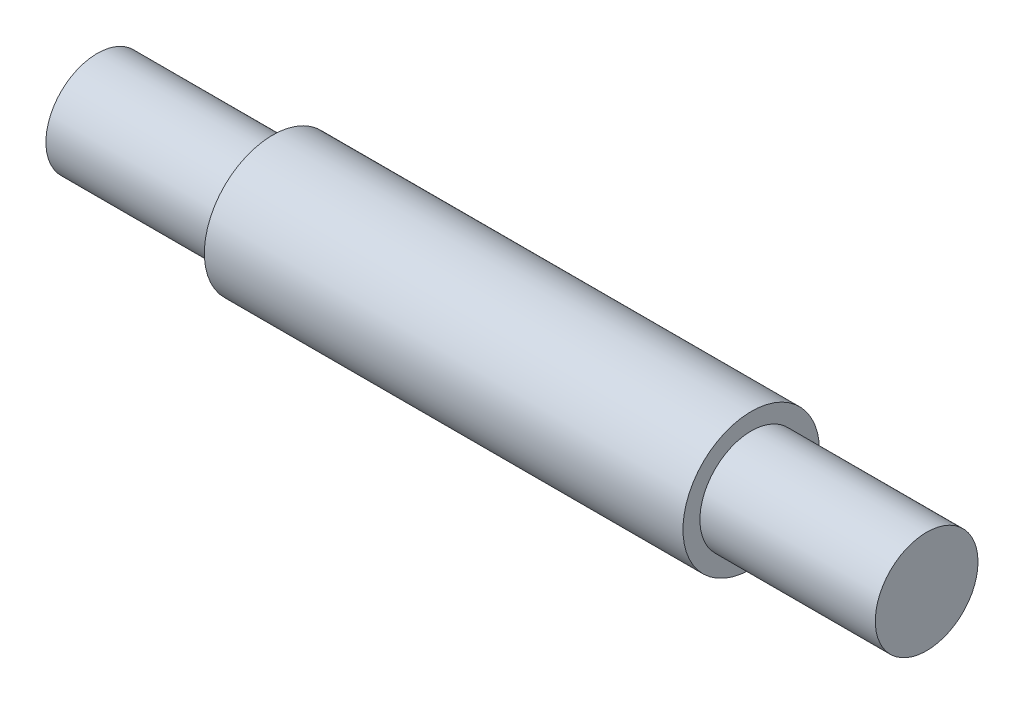
ISO-10303-21;
HEADER;
FILE_DESCRIPTION(('STEP AP214'),'2;1');
FILE_NAME('part.step','',(''),(''),'','','');
FILE_SCHEMA(('AUTOMOTIVE_DESIGN { 1 0 10303 214 1 1 1 1 }'));
ENDSEC;
DATA;
#1=APPLICATION_CONTEXT('core data for automotive mechanical design processes');
#2=APPLICATION_PROTOCOL_DEFINITION('international standard','automotive_design',2000,#1);
#3=PRODUCT_CONTEXT('',#1,'mechanical');
#4=PRODUCT('Part','Part','',(#3));
#5=PRODUCT_RELATED_PRODUCT_CATEGORY('part','',(#4));
#6=PRODUCT_DEFINITION_FORMATION('','',#4);
#7=PRODUCT_DEFINITION_CONTEXT('part definition',#1,'design');
#8=PRODUCT_DEFINITION('design','',#6,#7);
#9=PRODUCT_DEFINITION_SHAPE('','',#8);
#10=(LENGTH_UNIT() NAMED_UNIT(*) SI_UNIT(.MILLI.,.METRE.));
#11=(NAMED_UNIT(*) PLANE_ANGLE_UNIT() SI_UNIT($,.RADIAN.));
#12=(NAMED_UNIT(*) SI_UNIT($,.STERADIAN.) SOLID_ANGLE_UNIT());
#13=UNCERTAINTY_MEASURE_WITH_UNIT(LENGTH_MEASURE(1.E-05),#10,'distance_accuracy_value','');
#14=(GEOMETRIC_REPRESENTATION_CONTEXT(3) GLOBAL_UNCERTAINTY_ASSIGNED_CONTEXT((#13)) GLOBAL_UNIT_ASSIGNED_CONTEXT((#10,
#11,#12)) REPRESENTATION_CONTEXT('',''));
#15=CARTESIAN_POINT('',(0.,0.,0.));
#16=DIRECTION('',(0.,0.,1.));
#17=DIRECTION('',(1.,0.,0.));
#18=AXIS2_PLACEMENT_3D('',#15,#16,#17);
#19=CARTESIAN_POINT('',(19.2786,0.,0.));
#20=DIRECTION('',(-1.,0.,0.));
#21=DIRECTION('',(0.,0.,1.));
#22=AXIS2_PLACEMENT_3D('',#19,#20,#21);
#23=CYLINDRICAL_SURFACE('',#22,3.175);
#24=CARTESIAN_POINT('',(11.1252,0.,0.));
#25=DIRECTION('',(1.,0.,0.));
#26=DIRECTION('',(0.,0.,-1.));
#27=AXIS2_PLACEMENT_3D('',#24,#25,#26);
#28=CIRCLE('',#27,3.175);
#29=CARTESIAN_POINT('',(11.1252,0.,-3.175));
#30=VERTEX_POINT('',#29);
#31=EDGE_CURVE('E10',#30,#30,#28,.T.);
#32=ORIENTED_EDGE('',*,*,#31,.F.);
#33=EDGE_LOOP('',(#32));
#34=FACE_BOUND('',#33,.T.);
#35=CARTESIAN_POINT('',(-11.1252,0.,0.));
#36=DIRECTION('',(1.,0.,0.));
#37=DIRECTION('',(0.,0.,-1.));
#38=AXIS2_PLACEMENT_3D('',#35,#36,#37);
#39=CIRCLE('',#38,3.175);
#40=CARTESIAN_POINT('',(-11.1252,0.,-3.175));
#41=VERTEX_POINT('',#40);
#42=EDGE_CURVE('E55',#41,#41,#39,.T.);
#43=ORIENTED_EDGE('',*,*,#42,.T.);
#44=EDGE_LOOP('',(#43));
#45=FACE_BOUND('',#44,.T.);
#46=ADVANCED_FACE('F37',(#34,#45),#23,.T.);
#47=CARTESIAN_POINT('',(11.1252,0.,0.));
#48=DIRECTION('',(1.,0.,0.));
#49=DIRECTION('',(0.,0.,-1.));
#50=AXIS2_PLACEMENT_3D('',#47,#48,#49);
#51=PLANE('',#50);
#52=CARTESIAN_POINT('',(11.1252,0.,0.));
#53=DIRECTION('',(1.,0.,0.));
#54=DIRECTION('',(0.,0.,-1.));
#55=AXIS2_PLACEMENT_3D('',#52,#53,#54);
#56=CIRCLE('',#55,2.3876);
#57=CARTESIAN_POINT('',(11.1252,0.,-2.3876));
#58=VERTEX_POINT('',#57);
#59=EDGE_CURVE('E44',#58,#58,#56,.T.);
#60=ORIENTED_EDGE('',*,*,#59,.F.);
#61=EDGE_LOOP('',(#60));
#62=FACE_BOUND('',#61,.T.);
#63=ORIENTED_EDGE('',*,*,#31,.T.);
#64=EDGE_LOOP('',(#63));
#65=FACE_BOUND('',#64,.T.);
#66=ADVANCED_FACE('F83',(#62,#65),#51,.T.);
#67=CARTESIAN_POINT('',(11.1252,0.,0.));
#68=DIRECTION('',(1.,0.,0.));
#69=DIRECTION('',(0.,0.,-1.));
#70=AXIS2_PLACEMENT_3D('',#67,#68,#69);
#71=CYLINDRICAL_SURFACE('',#70,2.3876);
#72=ORIENTED_EDGE('',*,*,#59,.T.);
#73=EDGE_LOOP('',(#72));
#74=FACE_BOUND('',#73,.T.);
#75=CARTESIAN_POINT('',(19.2786,0.,0.));
#76=DIRECTION('',(1.,0.,0.));
#77=DIRECTION('',(0.,0.,-1.));
#78=AXIS2_PLACEMENT_3D('',#75,#76,#77);
#79=CIRCLE('',#78,2.3876);
#80=CARTESIAN_POINT('',(19.2786,0.,-2.3876));
#81=VERTEX_POINT('',#80);
#82=EDGE_CURVE('E49',#81,#81,#79,.T.);
#83=ORIENTED_EDGE('',*,*,#82,.F.);
#84=EDGE_LOOP('',(#83));
#85=FACE_BOUND('',#84,.T.);
#86=ADVANCED_FACE('F88',(#74,#85),#71,.T.);
#87=CARTESIAN_POINT('',(19.2786,0.,0.));
#88=DIRECTION('',(1.,0.,0.));
#89=DIRECTION('',(0.,0.,-1.));
#90=AXIS2_PLACEMENT_3D('',#87,#88,#89);
#91=PLANE('',#90);
#92=ORIENTED_EDGE('',*,*,#82,.T.);
#93=EDGE_LOOP('',(#92));
#94=FACE_BOUND('',#93,.T.);
#95=ADVANCED_FACE('F95',(#94),#91,.T.);
#96=CARTESIAN_POINT('',(-11.1252,0.,0.));
#97=DIRECTION('',(-1.,0.,0.));
#98=DIRECTION('',(0.,0.,-1.));
#99=AXIS2_PLACEMENT_3D('',#96,#97,#98);
#100=PLANE('',#99);
#101=ORIENTED_EDGE('',*,*,#42,.F.);
#102=EDGE_LOOP('',(#101));
#103=FACE_BOUND('',#102,.T.);
#104=CARTESIAN_POINT('',(-11.1252,0.,0.));
#105=DIRECTION('',(1.,0.,0.));
#106=DIRECTION('',(0.,0.,-1.));
#107=AXIS2_PLACEMENT_3D('',#104,#105,#106);
#108=CIRCLE('',#107,2.3876);
#109=CARTESIAN_POINT('',(-11.1252,0.,-2.3876));
#110=VERTEX_POINT('',#109);
#111=EDGE_CURVE('E60',#110,#110,#108,.T.);
#112=ORIENTED_EDGE('',*,*,#111,.T.);
#113=EDGE_LOOP('',(#112));
#114=FACE_BOUND('',#113,.T.);
#115=ADVANCED_FACE('F69',(#103,#114),#100,.T.);
#116=CARTESIAN_POINT('',(-11.1252,0.,0.));
#117=DIRECTION('',(-1.,0.,0.));
#118=DIRECTION('',(0.,0.,1.));
#119=AXIS2_PLACEMENT_3D('',#116,#117,#118);
#120=CYLINDRICAL_SURFACE('',#119,2.3876);
#121=ORIENTED_EDGE('',*,*,#111,.F.);
#122=EDGE_LOOP('',(#121));
#123=FACE_BOUND('',#122,.T.);
#124=CARTESIAN_POINT('',(-19.2786,0.,0.));
#125=DIRECTION('',(1.,0.,0.));
#126=DIRECTION('',(0.,0.,-1.));
#127=AXIS2_PLACEMENT_3D('',#124,#125,#126);
#128=CIRCLE('',#127,2.3876);
#129=CARTESIAN_POINT('',(-19.2786,0.,-2.3876));
#130=VERTEX_POINT('',#129);
#131=EDGE_CURVE('E61',#130,#130,#128,.T.);
#132=ORIENTED_EDGE('',*,*,#131,.T.);
#133=EDGE_LOOP('',(#132));
#134=FACE_BOUND('',#133,.T.);
#135=ADVANCED_FACE('F71',(#123,#134),#120,.T.);
#136=CARTESIAN_POINT('',(-19.2786,0.,0.));
#137=DIRECTION('',(1.,0.,0.));
#138=DIRECTION('',(0.,0.,-1.));
#139=AXIS2_PLACEMENT_3D('',#136,#137,#138);
#140=PLANE('',#139);
#141=ORIENTED_EDGE('',*,*,#131,.F.);
#142=EDGE_LOOP('',(#141));
#143=FACE_BOUND('',#142,.T.);
#144=ADVANCED_FACE('F74',(#143),#140,.F.);
#145=CLOSED_SHELL('',(#46,#66,#86,#95,#115,#135,#144));
#146=MANIFOLD_SOLID_BREP('B2',#145);
#147=ADVANCED_BREP_SHAPE_REPRESENTATION('',(#18,#146),#14);
#148=SHAPE_DEFINITION_REPRESENTATION(#9,#147);
ENDSEC;
END-ISO-10303-21;
